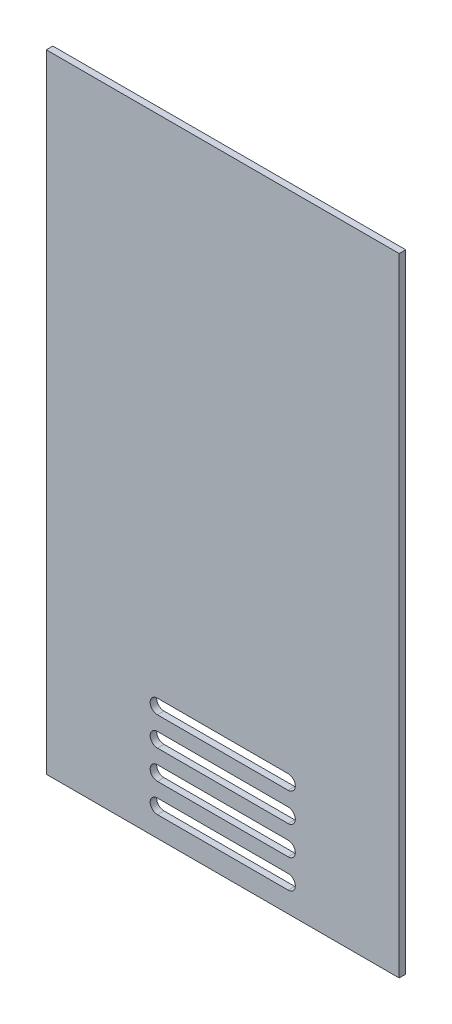
ISO-10303-21;
HEADER;
FILE_DESCRIPTION(('STEP AP214'),'2;1');
FILE_NAME('part.step','',(''),(''),'','','');
FILE_SCHEMA(('AUTOMOTIVE_DESIGN { 1 0 10303 214 1 1 1 1 }'));
ENDSEC;
DATA;
#1=APPLICATION_CONTEXT('core data for automotive mechanical design processes');
#2=APPLICATION_PROTOCOL_DEFINITION('international standard','automotive_design',2000,#1);
#3=PRODUCT_CONTEXT('',#1,'mechanical');
#4=PRODUCT('Part','Part','',(#3));
#5=PRODUCT_RELATED_PRODUCT_CATEGORY('part','',(#4));
#6=PRODUCT_DEFINITION_FORMATION('','',#4);
#7=PRODUCT_DEFINITION_CONTEXT('part definition',#1,'design');
#8=PRODUCT_DEFINITION('design','',#6,#7);
#9=PRODUCT_DEFINITION_SHAPE('','',#8);
#10=(LENGTH_UNIT() NAMED_UNIT(*) SI_UNIT(.MILLI.,.METRE.));
#11=(NAMED_UNIT(*) PLANE_ANGLE_UNIT() SI_UNIT($,.RADIAN.));
#12=(NAMED_UNIT(*) SI_UNIT($,.STERADIAN.) SOLID_ANGLE_UNIT());
#13=UNCERTAINTY_MEASURE_WITH_UNIT(LENGTH_MEASURE(1.E-05),#10,'distance_accuracy_value','');
#14=(GEOMETRIC_REPRESENTATION_CONTEXT(3) GLOBAL_UNCERTAINTY_ASSIGNED_CONTEXT((#13)) GLOBAL_UNIT_ASSIGNED_CONTEXT((#10,
#11,#12)) REPRESENTATION_CONTEXT('',''));
#15=CARTESIAN_POINT('',(0.,0.,0.));
#16=DIRECTION('',(0.,0.,1.));
#17=DIRECTION('',(1.,0.,0.));
#18=AXIS2_PLACEMENT_3D('',#15,#16,#17);
#19=CARTESIAN_POINT('',(-113.43670694864,87.7969033232628,3.175));
#20=DIRECTION('',(1.,0.,0.));
#21=DIRECTION('',(0.,1.,0.));
#22=AXIS2_PLACEMENT_3D('',#19,#20,#21);
#23=PLANE('',#22);
#24=DIRECTION('',(0.,-1.,0.));
#25=VECTOR('',#24,1.);
#26=CARTESIAN_POINT('',(-113.43670694864,87.7969033232628,0.));
#27=LINE('',#26,#25);
#28=CARTESIAN_POINT('',(-113.43670694864,87.7969033232628,0.));
#29=VERTEX_POINT('',#28);
#30=CARTESIAN_POINT('',(-113.43670694864,-217.003096676737,0.));
#31=VERTEX_POINT('',#30);
#32=EDGE_CURVE('E206',#29,#31,#27,.T.);
#33=ORIENTED_EDGE('',*,*,#32,.T.);
#34=DIRECTION('',(0.,0.,-1.));
#35=VECTOR('',#34,1.);
#36=CARTESIAN_POINT('',(-113.43670694864,-217.003096676737,3.175));
#37=LINE('',#36,#35);
#38=CARTESIAN_POINT('',(-113.43670694864,-217.003096676737,3.175));
#39=VERTEX_POINT('',#38);
#40=EDGE_CURVE('E11',#39,#31,#37,.T.);
#41=ORIENTED_EDGE('',*,*,#40,.F.);
#42=DIRECTION('',(0.,-1.,0.));
#43=VECTOR('',#42,1.);
#44=CARTESIAN_POINT('',(-113.43670694864,87.7969033232628,3.175));
#45=LINE('',#44,#43);
#46=CARTESIAN_POINT('',(-113.43670694864,87.7969033232628,3.175));
#47=VERTEX_POINT('',#46);
#48=EDGE_CURVE('E303',#47,#39,#45,.T.);
#49=ORIENTED_EDGE('',*,*,#48,.F.);
#50=DIRECTION('',(0.,0.,-1.));
#51=VECTOR('',#50,1.);
#52=CARTESIAN_POINT('',(-113.43670694864,87.7969033232628,3.175));
#53=LINE('',#52,#51);
#54=EDGE_CURVE('E313',#47,#29,#53,.T.);
#55=ORIENTED_EDGE('',*,*,#54,.T.);
#56=EDGE_LOOP('',(#33,#41,#49,#55));
#57=FACE_BOUND('',#56,.T.);
#58=ADVANCED_FACE('F33',(#57),#23,.F.);
#59=CARTESIAN_POINT('',(-113.43670694864,-217.003096676737,3.175));
#60=DIRECTION('',(0.,1.,0.));
#61=DIRECTION('',(0.,0.,1.));
#62=AXIS2_PLACEMENT_3D('',#59,#60,#61);
#63=PLANE('',#62);
#64=DIRECTION('',(1.,0.,0.));
#65=VECTOR('',#64,1.);
#66=CARTESIAN_POINT('',(-113.43670694864,-217.003096676737,0.));
#67=LINE('',#66,#65);
#68=CARTESIAN_POINT('',(58.0132930513596,-217.003096676737,0.));
#69=VERTEX_POINT('',#68);
#70=EDGE_CURVE('E316',#31,#69,#67,.T.);
#71=ORIENTED_EDGE('',*,*,#70,.T.);
#72=DIRECTION('',(0.,0.,-1.));
#73=VECTOR('',#72,1.);
#74=CARTESIAN_POINT('',(58.0132930513596,-217.003096676737,3.175));
#75=LINE('',#74,#73);
#76=CARTESIAN_POINT('',(58.0132930513596,-217.003096676737,3.175));
#77=VERTEX_POINT('',#76);
#78=EDGE_CURVE('E40',#77,#69,#75,.T.);
#79=ORIENTED_EDGE('',*,*,#78,.F.);
#80=DIRECTION('',(1.,0.,0.));
#81=VECTOR('',#80,1.);
#82=CARTESIAN_POINT('',(-113.43670694864,-217.003096676737,3.175));
#83=LINE('',#82,#81);
#84=EDGE_CURVE('E306',#39,#77,#83,.T.);
#85=ORIENTED_EDGE('',*,*,#84,.F.);
#86=ORIENTED_EDGE('',*,*,#40,.T.);
#87=EDGE_LOOP('',(#71,#79,#85,#86));
#88=FACE_BOUND('',#87,.T.);
#89=ADVANCED_FACE('F345',(#88),#63,.F.);
#90=CARTESIAN_POINT('',(58.0132930513595,87.7969033232628,3.175));
#91=DIRECTION('',(-1.,0.,0.));
#92=DIRECTION('',(0.,-1.,0.));
#93=AXIS2_PLACEMENT_3D('',#90,#91,#92);
#94=PLANE('',#93);
#95=DIRECTION('',(0.,1.,0.));
#96=VECTOR('',#95,1.);
#97=CARTESIAN_POINT('',(58.0132930513595,87.7969033232628,0.));
#98=LINE('',#97,#96);
#99=CARTESIAN_POINT('',(58.0132930513595,87.7969033232628,0.));
#100=VERTEX_POINT('',#99);
#101=EDGE_CURVE('E318',#69,#100,#98,.T.);
#102=ORIENTED_EDGE('',*,*,#101,.T.);
#103=DIRECTION('',(0.,0.,-1.));
#104=VECTOR('',#103,1.);
#105=CARTESIAN_POINT('',(58.0132930513595,87.7969033232628,3.175));
#106=LINE('',#105,#104);
#107=CARTESIAN_POINT('',(58.0132930513595,87.7969033232628,3.175));
#108=VERTEX_POINT('',#107);
#109=EDGE_CURVE('E323',#108,#100,#106,.T.);
#110=ORIENTED_EDGE('',*,*,#109,.F.);
#111=DIRECTION('',(0.,1.,0.));
#112=VECTOR('',#111,1.);
#113=CARTESIAN_POINT('',(58.0132930513595,87.7969033232628,3.175));
#114=LINE('',#113,#112);
#115=EDGE_CURVE('E309',#77,#108,#114,.T.);
#116=ORIENTED_EDGE('',*,*,#115,.F.);
#117=ORIENTED_EDGE('',*,*,#78,.T.);
#118=EDGE_LOOP('',(#102,#110,#116,#117));
#119=FACE_BOUND('',#118,.T.);
#120=ADVANCED_FACE('F330',(#119),#94,.F.);
#121=CARTESIAN_POINT('',(-113.43670694864,87.7969033232628,3.175));
#122=DIRECTION('',(0.,-1.,0.));
#123=DIRECTION('',(0.,0.,-1.));
#124=AXIS2_PLACEMENT_3D('',#121,#122,#123);
#125=PLANE('',#124);
#126=DIRECTION('',(-1.,0.,0.));
#127=VECTOR('',#126,1.);
#128=CARTESIAN_POINT('',(-113.43670694864,87.7969033232628,0.));
#129=LINE('',#128,#127);
#130=EDGE_CURVE('E307',#100,#29,#129,.T.);
#131=ORIENTED_EDGE('',*,*,#130,.T.);
#132=ORIENTED_EDGE('',*,*,#54,.F.);
#133=DIRECTION('',(-1.,0.,0.));
#134=VECTOR('',#133,1.);
#135=CARTESIAN_POINT('',(-113.43670694864,87.7969033232628,3.175));
#136=LINE('',#135,#134);
#137=EDGE_CURVE('E311',#108,#47,#136,.T.);
#138=ORIENTED_EDGE('',*,*,#137,.F.);
#139=ORIENTED_EDGE('',*,*,#109,.T.);
#140=EDGE_LOOP('',(#131,#132,#138,#139));
#141=FACE_BOUND('',#140,.T.);
#142=ADVANCED_FACE('F338',(#141),#125,.F.);
#143=CARTESIAN_POINT('',(0.,0.,3.175));
#144=DIRECTION('',(0.,0.,1.));
#145=DIRECTION('',(1.,0.,0.));
#146=AXIS2_PLACEMENT_3D('',#143,#144,#145);
#147=PLANE('',#146);
#148=CARTESIAN_POINT('',(-59.4617069486404,-203.503096676737,3.175));
#149=DIRECTION('',(0.,0.,1.));
#150=DIRECTION('',(1.,0.,0.));
#151=AXIS2_PLACEMENT_3D('',#148,#149,#150);
#152=CIRCLE('',#151,3.49999999999999);
#153=CARTESIAN_POINT('',(-59.4617069486404,-200.003096676737,3.175));
#154=VERTEX_POINT('',#153);
#155=CARTESIAN_POINT('',(-59.4617069486404,-207.003096676737,3.175));
#156=VERTEX_POINT('',#155);
#157=EDGE_CURVE('E47',#154,#156,#152,.T.);
#158=ORIENTED_EDGE('',*,*,#157,.F.);
#159=DIRECTION('',(-1.,0.,0.));
#160=VECTOR('',#159,1.);
#161=CARTESIAN_POINT('',(-59.4617069486404,-200.003096676737,3.175));
#162=LINE('',#161,#160);
#163=CARTESIAN_POINT('',(4.03829305135959,-200.003096676737,3.175));
#164=VERTEX_POINT('',#163);
#165=EDGE_CURVE('E190',#164,#154,#162,.T.);
#166=ORIENTED_EDGE('',*,*,#165,.F.);
#167=CARTESIAN_POINT('',(4.03829305135959,-203.503096676737,3.175));
#168=DIRECTION('',(0.,0.,1.));
#169=DIRECTION('',(-1.,0.,0.));
#170=AXIS2_PLACEMENT_3D('',#167,#168,#169);
#171=CIRCLE('',#170,3.49999999999999);
#172=CARTESIAN_POINT('',(4.03829305135959,-207.003096676737,3.175));
#173=VERTEX_POINT('',#172);
#174=EDGE_CURVE('E193',#173,#164,#171,.T.);
#175=ORIENTED_EDGE('',*,*,#174,.F.);
#176=DIRECTION('',(1.,0.,0.));
#177=VECTOR('',#176,1.);
#178=CARTESIAN_POINT('',(-59.4617069486404,-207.003096676737,3.175));
#179=LINE('',#178,#177);
#180=EDGE_CURVE('E199',#156,#173,#179,.T.);
#181=ORIENTED_EDGE('',*,*,#180,.F.);
#182=EDGE_LOOP('',(#158,#166,#175,#181));
#183=FACE_BOUND('',#182,.T.);
#184=CARTESIAN_POINT('',(-59.4617069486404,-189.503096676737,3.175));
#185=DIRECTION('',(0.,0.,1.));
#186=DIRECTION('',(1.,0.,0.));
#187=AXIS2_PLACEMENT_3D('',#184,#185,#186);
#188=CIRCLE('',#187,3.49999999999998);
#189=CARTESIAN_POINT('',(-59.4617069486404,-186.003096676737,3.175));
#190=VERTEX_POINT('',#189);
#191=CARTESIAN_POINT('',(-59.4617069486404,-193.003096676737,3.175));
#192=VERTEX_POINT('',#191);
#193=EDGE_CURVE('E55',#190,#192,#188,.T.);
#194=ORIENTED_EDGE('',*,*,#193,.F.);
#195=DIRECTION('',(-1.,0.,0.));
#196=VECTOR('',#195,1.);
#197=CARTESIAN_POINT('',(-59.4617069486404,-186.003096676737,3.175));
#198=LINE('',#197,#196);
#199=CARTESIAN_POINT('',(4.03829305135958,-186.003096676737,3.175));
#200=VERTEX_POINT('',#199);
#201=EDGE_CURVE('E214',#200,#190,#198,.T.);
#202=ORIENTED_EDGE('',*,*,#201,.F.);
#203=CARTESIAN_POINT('',(4.03829305135958,-189.503096676737,3.175));
#204=DIRECTION('',(0.,0.,1.));
#205=DIRECTION('',(-1.,0.,0.));
#206=AXIS2_PLACEMENT_3D('',#203,#204,#205);
#207=CIRCLE('',#206,3.49999999999998);
#208=CARTESIAN_POINT('',(4.03829305135958,-193.003096676737,3.175));
#209=VERTEX_POINT('',#208);
#210=EDGE_CURVE('E229',#209,#200,#207,.T.);
#211=ORIENTED_EDGE('',*,*,#210,.F.);
#212=DIRECTION('',(1.,0.,0.));
#213=VECTOR('',#212,1.);
#214=CARTESIAN_POINT('',(-59.4617069486404,-193.003096676737,3.175));
#215=LINE('',#214,#213);
#216=EDGE_CURVE('E225',#192,#209,#215,.T.);
#217=ORIENTED_EDGE('',*,*,#216,.F.);
#218=EDGE_LOOP('',(#194,#202,#211,#217));
#219=FACE_BOUND('',#218,.T.);
#220=CARTESIAN_POINT('',(-59.4617069486404,-175.503096676737,3.175));
#221=DIRECTION('',(0.,0.,1.));
#222=DIRECTION('',(1.,0.,0.));
#223=AXIS2_PLACEMENT_3D('',#220,#221,#222);
#224=CIRCLE('',#223,3.49999999999998);
#225=CARTESIAN_POINT('',(-59.4617069486404,-172.003096676737,3.175));
#226=VERTEX_POINT('',#225);
#227=CARTESIAN_POINT('',(-59.4617069486404,-179.003096676737,3.175));
#228=VERTEX_POINT('',#227);
#229=EDGE_CURVE('E254',#226,#228,#224,.T.);
#230=ORIENTED_EDGE('',*,*,#229,.F.);
#231=DIRECTION('',(-1.,0.,0.));
#232=VECTOR('',#231,1.);
#233=CARTESIAN_POINT('',(-59.4617069486404,-172.003096676737,3.175));
#234=LINE('',#233,#232);
#235=CARTESIAN_POINT('',(4.03829305135959,-172.003096676737,3.175));
#236=VERTEX_POINT('',#235);
#237=EDGE_CURVE('E244',#236,#226,#234,.T.);
#238=ORIENTED_EDGE('',*,*,#237,.F.);
#239=CARTESIAN_POINT('',(4.03829305135959,-175.503096676737,3.175));
#240=DIRECTION('',(0.,0.,1.));
#241=DIRECTION('',(-1.,0.,0.));
#242=AXIS2_PLACEMENT_3D('',#239,#240,#241);
#243=CIRCLE('',#242,3.49999999999998);
#244=CARTESIAN_POINT('',(4.03829305135959,-179.003096676737,3.175));
#245=VERTEX_POINT('',#244);
#246=EDGE_CURVE('E260',#245,#236,#243,.T.);
#247=ORIENTED_EDGE('',*,*,#246,.F.);
#248=DIRECTION('',(1.,0.,0.));
#249=VECTOR('',#248,1.);
#250=CARTESIAN_POINT('',(-59.4617069486404,-179.003096676737,3.175));
#251=LINE('',#250,#249);
#252=EDGE_CURVE('E256',#228,#245,#251,.T.);
#253=ORIENTED_EDGE('',*,*,#252,.F.);
#254=EDGE_LOOP('',(#230,#238,#247,#253));
#255=FACE_BOUND('',#254,.T.);
#256=CARTESIAN_POINT('',(-59.4617069486404,-161.503096676737,3.175));
#257=DIRECTION('',(0.,0.,1.));
#258=DIRECTION('',(1.,0.,0.));
#259=AXIS2_PLACEMENT_3D('',#256,#257,#258);
#260=CIRCLE('',#259,3.49999999999998);
#261=CARTESIAN_POINT('',(-59.4617069486404,-158.003096676737,3.175));
#262=VERTEX_POINT('',#261);
#263=CARTESIAN_POINT('',(-59.4617069486404,-165.003096676737,3.175));
#264=VERTEX_POINT('',#263);
#265=EDGE_CURVE('E286',#262,#264,#260,.T.);
#266=ORIENTED_EDGE('',*,*,#265,.F.);
#267=DIRECTION('',(-1.,0.,0.));
#268=VECTOR('',#267,1.);
#269=CARTESIAN_POINT('',(-59.4617069486404,-158.003096676737,3.175));
#270=LINE('',#269,#268);
#271=CARTESIAN_POINT('',(4.03829305135958,-158.003096676737,3.175));
#272=VERTEX_POINT('',#271);
#273=EDGE_CURVE('E276',#272,#262,#270,.T.);
#274=ORIENTED_EDGE('',*,*,#273,.F.);
#275=CARTESIAN_POINT('',(4.03829305135958,-161.503096676737,3.175));
#276=DIRECTION('',(0.,0.,1.));
#277=DIRECTION('',(-1.,0.,0.));
#278=AXIS2_PLACEMENT_3D('',#275,#276,#277);
#279=CIRCLE('',#278,3.49999999999998);
#280=CARTESIAN_POINT('',(4.03829305135958,-165.003096676737,3.175));
#281=VERTEX_POINT('',#280);
#282=EDGE_CURVE('E291',#281,#272,#279,.T.);
#283=ORIENTED_EDGE('',*,*,#282,.F.);
#284=DIRECTION('',(1.,0.,0.));
#285=VECTOR('',#284,1.);
#286=CARTESIAN_POINT('',(-59.4617069486404,-165.003096676737,3.175));
#287=LINE('',#286,#285);
#288=EDGE_CURVE('E288',#264,#281,#287,.T.);
#289=ORIENTED_EDGE('',*,*,#288,.F.);
#290=EDGE_LOOP('',(#266,#274,#283,#289));
#291=FACE_BOUND('',#290,.T.);
#292=ORIENTED_EDGE('',*,*,#48,.T.);
#293=ORIENTED_EDGE('',*,*,#84,.T.);
#294=ORIENTED_EDGE('',*,*,#115,.T.);
#295=ORIENTED_EDGE('',*,*,#137,.T.);
#296=EDGE_LOOP('',(#292,#293,#294,#295));
#297=FACE_BOUND('',#296,.T.);
#298=ADVANCED_FACE('F344',(#183,#219,#255,#291,#297),#147,.T.);
#299=CARTESIAN_POINT('',(0.,0.,0.));
#300=DIRECTION('',(0.,0.,1.));
#301=DIRECTION('',(1.,0.,0.));
#302=AXIS2_PLACEMENT_3D('',#299,#300,#301);
#303=PLANE('',#302);
#304=DIRECTION('',(-1.,0.,0.));
#305=VECTOR('',#304,1.);
#306=CARTESIAN_POINT('',(-59.4617069486404,-200.003096676737,0.));
#307=LINE('',#306,#305);
#308=CARTESIAN_POINT('',(4.03829305135959,-200.003096676737,0.));
#309=VERTEX_POINT('',#308);
#310=CARTESIAN_POINT('',(-59.4617069486404,-200.003096676737,0.));
#311=VERTEX_POINT('',#310);
#312=EDGE_CURVE('E177',#309,#311,#307,.T.);
#313=ORIENTED_EDGE('',*,*,#312,.T.);
#314=CARTESIAN_POINT('',(-59.4617069486404,-203.503096676737,0.));
#315=DIRECTION('',(0.,0.,1.));
#316=DIRECTION('',(1.,0.,0.));
#317=AXIS2_PLACEMENT_3D('',#314,#315,#316);
#318=CIRCLE('',#317,3.49999999999999);
#319=CARTESIAN_POINT('',(-59.4617069486404,-207.003096676737,0.));
#320=VERTEX_POINT('',#319);
#321=EDGE_CURVE('E171',#311,#320,#318,.T.);
#322=ORIENTED_EDGE('',*,*,#321,.T.);
#323=DIRECTION('',(1.,0.,0.));
#324=VECTOR('',#323,1.);
#325=CARTESIAN_POINT('',(-59.4617069486404,-207.003096676737,0.));
#326=LINE('',#325,#324);
#327=CARTESIAN_POINT('',(4.03829305135959,-207.003096676737,0.));
#328=VERTEX_POINT('',#327);
#329=EDGE_CURVE('E181',#320,#328,#326,.T.);
#330=ORIENTED_EDGE('',*,*,#329,.T.);
#331=CARTESIAN_POINT('',(4.03829305135959,-203.503096676737,0.));
#332=DIRECTION('',(0.,0.,1.));
#333=DIRECTION('',(-1.,0.,0.));
#334=AXIS2_PLACEMENT_3D('',#331,#332,#333);
#335=CIRCLE('',#334,3.49999999999999);
#336=EDGE_CURVE('E185',#328,#309,#335,.T.);
#337=ORIENTED_EDGE('',*,*,#336,.T.);
#338=EDGE_LOOP('',(#313,#322,#330,#337));
#339=FACE_BOUND('',#338,.T.);
#340=DIRECTION('',(-1.,0.,0.));
#341=VECTOR('',#340,1.);
#342=CARTESIAN_POINT('',(-59.4617069486404,-186.003096676737,0.));
#343=LINE('',#342,#341);
#344=CARTESIAN_POINT('',(4.03829305135958,-186.003096676737,0.));
#345=VERTEX_POINT('',#344);
#346=CARTESIAN_POINT('',(-59.4617069486404,-186.003096676737,0.));
#347=VERTEX_POINT('',#346);
#348=EDGE_CURVE('E220',#345,#347,#343,.T.);
#349=ORIENTED_EDGE('',*,*,#348,.T.);
#350=CARTESIAN_POINT('',(-59.4617069486404,-189.503096676737,0.));
#351=DIRECTION('',(0.,0.,1.));
#352=DIRECTION('',(1.,0.,0.));
#353=AXIS2_PLACEMENT_3D('',#350,#351,#352);
#354=CIRCLE('',#353,3.49999999999998);
#355=CARTESIAN_POINT('',(-59.4617069486404,-193.003096676737,0.));
#356=VERTEX_POINT('',#355);
#357=EDGE_CURVE('E210',#347,#356,#354,.T.);
#358=ORIENTED_EDGE('',*,*,#357,.T.);
#359=DIRECTION('',(1.,0.,0.));
#360=VECTOR('',#359,1.);
#361=CARTESIAN_POINT('',(-59.4617069486404,-193.003096676737,0.));
#362=LINE('',#361,#360);
#363=CARTESIAN_POINT('',(4.03829305135958,-193.003096676737,0.));
#364=VERTEX_POINT('',#363);
#365=EDGE_CURVE('E213',#356,#364,#362,.T.);
#366=ORIENTED_EDGE('',*,*,#365,.T.);
#367=CARTESIAN_POINT('',(4.03829305135958,-189.503096676737,0.));
#368=DIRECTION('',(0.,0.,1.));
#369=DIRECTION('',(-1.,0.,0.));
#370=AXIS2_PLACEMENT_3D('',#367,#368,#369);
#371=CIRCLE('',#370,3.49999999999998);
#372=EDGE_CURVE('E217',#364,#345,#371,.T.);
#373=ORIENTED_EDGE('',*,*,#372,.T.);
#374=EDGE_LOOP('',(#349,#358,#366,#373));
#375=FACE_BOUND('',#374,.T.);
#376=DIRECTION('',(-1.,0.,0.));
#377=VECTOR('',#376,1.);
#378=CARTESIAN_POINT('',(-59.4617069486404,-172.003096676737,0.));
#379=LINE('',#378,#377);
#380=CARTESIAN_POINT('',(4.03829305135959,-172.003096676737,0.));
#381=VERTEX_POINT('',#380);
#382=CARTESIAN_POINT('',(-59.4617069486404,-172.003096676737,0.));
#383=VERTEX_POINT('',#382);
#384=EDGE_CURVE('E250',#381,#383,#379,.T.);
#385=ORIENTED_EDGE('',*,*,#384,.T.);
#386=CARTESIAN_POINT('',(-59.4617069486404,-175.503096676737,0.));
#387=DIRECTION('',(0.,0.,1.));
#388=DIRECTION('',(1.,0.,0.));
#389=AXIS2_PLACEMENT_3D('',#386,#387,#388);
#390=CIRCLE('',#389,3.49999999999998);
#391=CARTESIAN_POINT('',(-59.4617069486404,-179.003096676737,0.));
#392=VERTEX_POINT('',#391);
#393=EDGE_CURVE('E240',#383,#392,#390,.T.);
#394=ORIENTED_EDGE('',*,*,#393,.T.);
#395=DIRECTION('',(1.,0.,0.));
#396=VECTOR('',#395,1.);
#397=CARTESIAN_POINT('',(-59.4617069486404,-179.003096676737,0.));
#398=LINE('',#397,#396);
#399=CARTESIAN_POINT('',(4.03829305135959,-179.003096676737,0.));
#400=VERTEX_POINT('',#399);
#401=EDGE_CURVE('E243',#392,#400,#398,.T.);
#402=ORIENTED_EDGE('',*,*,#401,.T.);
#403=CARTESIAN_POINT('',(4.03829305135959,-175.503096676737,0.));
#404=DIRECTION('',(0.,0.,1.));
#405=DIRECTION('',(-1.,0.,0.));
#406=AXIS2_PLACEMENT_3D('',#403,#404,#405);
#407=CIRCLE('',#406,3.49999999999998);
#408=EDGE_CURVE('E247',#400,#381,#407,.T.);
#409=ORIENTED_EDGE('',*,*,#408,.T.);
#410=EDGE_LOOP('',(#385,#394,#402,#409));
#411=FACE_BOUND('',#410,.T.);
#412=DIRECTION('',(-1.,0.,0.));
#413=VECTOR('',#412,1.);
#414=CARTESIAN_POINT('',(-59.4617069486404,-158.003096676737,0.));
#415=LINE('',#414,#413);
#416=CARTESIAN_POINT('',(4.03829305135958,-158.003096676737,0.));
#417=VERTEX_POINT('',#416);
#418=CARTESIAN_POINT('',(-59.4617069486404,-158.003096676737,0.));
#419=VERTEX_POINT('',#418);
#420=EDGE_CURVE('E282',#417,#419,#415,.T.);
#421=ORIENTED_EDGE('',*,*,#420,.T.);
#422=CARTESIAN_POINT('',(-59.4617069486404,-161.503096676737,0.));
#423=DIRECTION('',(0.,0.,1.));
#424=DIRECTION('',(1.,0.,0.));
#425=AXIS2_PLACEMENT_3D('',#422,#423,#424);
#426=CIRCLE('',#425,3.49999999999998);
#427=CARTESIAN_POINT('',(-59.4617069486404,-165.003096676737,0.));
#428=VERTEX_POINT('',#427);
#429=EDGE_CURVE('E272',#419,#428,#426,.T.);
#430=ORIENTED_EDGE('',*,*,#429,.T.);
#431=DIRECTION('',(1.,0.,0.));
#432=VECTOR('',#431,1.);
#433=CARTESIAN_POINT('',(-59.4617069486404,-165.003096676737,0.));
#434=LINE('',#433,#432);
#435=CARTESIAN_POINT('',(4.03829305135958,-165.003096676737,0.));
#436=VERTEX_POINT('',#435);
#437=EDGE_CURVE('E275',#428,#436,#434,.T.);
#438=ORIENTED_EDGE('',*,*,#437,.T.);
#439=CARTESIAN_POINT('',(4.03829305135958,-161.503096676737,0.));
#440=DIRECTION('',(0.,0.,1.));
#441=DIRECTION('',(-1.,0.,0.));
#442=AXIS2_PLACEMENT_3D('',#439,#440,#441);
#443=CIRCLE('',#442,3.49999999999998);
#444=EDGE_CURVE('E279',#436,#417,#443,.T.);
#445=ORIENTED_EDGE('',*,*,#444,.T.);
#446=EDGE_LOOP('',(#421,#430,#438,#445));
#447=FACE_BOUND('',#446,.T.);
#448=ORIENTED_EDGE('',*,*,#32,.F.);
#449=ORIENTED_EDGE('',*,*,#130,.F.);
#450=ORIENTED_EDGE('',*,*,#101,.F.);
#451=ORIENTED_EDGE('',*,*,#70,.F.);
#452=EDGE_LOOP('',(#448,#449,#450,#451));
#453=FACE_BOUND('',#452,.T.);
#454=ADVANCED_FACE('F187',(#339,#375,#411,#447,#453),#303,.F.);
#455=CARTESIAN_POINT('',(-59.4617069486404,-161.503096676737,0.));
#456=DIRECTION('',(0.,0.,1.));
#457=DIRECTION('',(1.,0.,0.));
#458=AXIS2_PLACEMENT_3D('',#455,#456,#457);
#459=CYLINDRICAL_SURFACE('',#458,3.49999999999998);
#460=ORIENTED_EDGE('',*,*,#265,.T.);
#461=DIRECTION('',(0.,0.,1.));
#462=VECTOR('',#461,1.);
#463=CARTESIAN_POINT('',(-59.4617069486404,-165.003096676737,0.));
#464=LINE('',#463,#462);
#465=EDGE_CURVE('E285',#428,#264,#464,.T.);
#466=ORIENTED_EDGE('',*,*,#465,.F.);
#467=ORIENTED_EDGE('',*,*,#429,.F.);
#468=DIRECTION('',(0.,0.,1.));
#469=VECTOR('',#468,1.);
#470=CARTESIAN_POINT('',(-59.4617069486404,-158.003096676737,0.));
#471=LINE('',#470,#469);
#472=EDGE_CURVE('E257',#419,#262,#471,.T.);
#473=ORIENTED_EDGE('',*,*,#472,.T.);
#474=EDGE_LOOP('',(#460,#466,#467,#473));
#475=FACE_BOUND('',#474,.T.);
#476=ADVANCED_FACE('F357',(#475),#459,.F.);
#477=CARTESIAN_POINT('',(-59.4617069486404,-158.003096676737,0.));
#478=DIRECTION('',(0.,1.,0.));
#479=DIRECTION('',(0.,0.,1.));
#480=AXIS2_PLACEMENT_3D('',#477,#478,#479);
#481=PLANE('',#480);
#482=ORIENTED_EDGE('',*,*,#273,.T.);
#483=ORIENTED_EDGE('',*,*,#472,.F.);
#484=ORIENTED_EDGE('',*,*,#420,.F.);
#485=DIRECTION('',(0.,0.,1.));
#486=VECTOR('',#485,1.);
#487=CARTESIAN_POINT('',(4.03829305135958,-158.003096676737,0.));
#488=LINE('',#487,#486);
#489=EDGE_CURVE('E297',#417,#272,#488,.T.);
#490=ORIENTED_EDGE('',*,*,#489,.T.);
#491=EDGE_LOOP('',(#482,#483,#484,#490));
#492=FACE_BOUND('',#491,.T.);
#493=ADVANCED_FACE('F363',(#492),#481,.F.);
#494=CARTESIAN_POINT('',(4.03829305135958,-161.503096676737,0.));
#495=DIRECTION('',(0.,0.,1.));
#496=DIRECTION('',(1.,0.,0.));
#497=AXIS2_PLACEMENT_3D('',#494,#495,#496);
#498=CYLINDRICAL_SURFACE('',#497,3.49999999999998);
#499=ORIENTED_EDGE('',*,*,#282,.T.);
#500=ORIENTED_EDGE('',*,*,#489,.F.);
#501=ORIENTED_EDGE('',*,*,#444,.F.);
#502=DIRECTION('',(0.,0.,1.));
#503=VECTOR('',#502,1.);
#504=CARTESIAN_POINT('',(4.03829305135958,-165.003096676737,0.));
#505=LINE('',#504,#503);
#506=EDGE_CURVE('E299',#436,#281,#505,.T.);
#507=ORIENTED_EDGE('',*,*,#506,.T.);
#508=EDGE_LOOP('',(#499,#500,#501,#507));
#509=FACE_BOUND('',#508,.T.);
#510=ADVANCED_FACE('F369',(#509),#498,.F.);
#511=CARTESIAN_POINT('',(-59.4617069486404,-165.003096676737,0.));
#512=DIRECTION('',(0.,-1.,0.));
#513=DIRECTION('',(0.,0.,-1.));
#514=AXIS2_PLACEMENT_3D('',#511,#512,#513);
#515=PLANE('',#514);
#516=ORIENTED_EDGE('',*,*,#288,.T.);
#517=ORIENTED_EDGE('',*,*,#506,.F.);
#518=ORIENTED_EDGE('',*,*,#437,.F.);
#519=ORIENTED_EDGE('',*,*,#465,.T.);
#520=EDGE_LOOP('',(#516,#517,#518,#519));
#521=FACE_BOUND('',#520,.T.);
#522=ADVANCED_FACE('F365',(#521),#515,.F.);
#523=CARTESIAN_POINT('',(-59.4617069486404,-175.503096676737,0.));
#524=DIRECTION('',(0.,0.,1.));
#525=DIRECTION('',(1.,0.,0.));
#526=AXIS2_PLACEMENT_3D('',#523,#524,#525);
#527=CYLINDRICAL_SURFACE('',#526,3.49999999999998);
#528=ORIENTED_EDGE('',*,*,#229,.T.);
#529=DIRECTION('',(0.,0.,1.));
#530=VECTOR('',#529,1.);
#531=CARTESIAN_POINT('',(-59.4617069486404,-179.003096676737,0.));
#532=LINE('',#531,#530);
#533=EDGE_CURVE('E253',#392,#228,#532,.T.);
#534=ORIENTED_EDGE('',*,*,#533,.F.);
#535=ORIENTED_EDGE('',*,*,#393,.F.);
#536=DIRECTION('',(0.,0.,1.));
#537=VECTOR('',#536,1.);
#538=CARTESIAN_POINT('',(-59.4617069486404,-172.003096676737,0.));
#539=LINE('',#538,#537);
#540=EDGE_CURVE('E226',#383,#226,#539,.T.);
#541=ORIENTED_EDGE('',*,*,#540,.T.);
#542=EDGE_LOOP('',(#528,#534,#535,#541));
#543=FACE_BOUND('',#542,.T.);
#544=ADVANCED_FACE('F368',(#543),#527,.F.);
#545=CARTESIAN_POINT('',(-59.4617069486404,-172.003096676737,0.));
#546=DIRECTION('',(0.,1.,0.));
#547=DIRECTION('',(0.,0.,1.));
#548=AXIS2_PLACEMENT_3D('',#545,#546,#547);
#549=PLANE('',#548);
#550=ORIENTED_EDGE('',*,*,#237,.T.);
#551=ORIENTED_EDGE('',*,*,#540,.F.);
#552=ORIENTED_EDGE('',*,*,#384,.F.);
#553=DIRECTION('',(0.,0.,1.));
#554=VECTOR('',#553,1.);
#555=CARTESIAN_POINT('',(4.03829305135959,-172.003096676737,0.));
#556=LINE('',#555,#554);
#557=EDGE_CURVE('E266',#381,#236,#556,.T.);
#558=ORIENTED_EDGE('',*,*,#557,.T.);
#559=EDGE_LOOP('',(#550,#551,#552,#558));
#560=FACE_BOUND('',#559,.T.);
#561=ADVANCED_FACE('F379',(#560),#549,.F.);
#562=CARTESIAN_POINT('',(4.03829305135959,-175.503096676737,0.));
#563=DIRECTION('',(0.,0.,1.));
#564=DIRECTION('',(1.,0.,0.));
#565=AXIS2_PLACEMENT_3D('',#562,#563,#564);
#566=CYLINDRICAL_SURFACE('',#565,3.49999999999998);
#567=ORIENTED_EDGE('',*,*,#246,.T.);
#568=ORIENTED_EDGE('',*,*,#557,.F.);
#569=ORIENTED_EDGE('',*,*,#408,.F.);
#570=DIRECTION('',(0.,0.,1.));
#571=VECTOR('',#570,1.);
#572=CARTESIAN_POINT('',(4.03829305135959,-179.003096676737,0.));
#573=LINE('',#572,#571);
#574=EDGE_CURVE('E268',#400,#245,#573,.T.);
#575=ORIENTED_EDGE('',*,*,#574,.T.);
#576=EDGE_LOOP('',(#567,#568,#569,#575));
#577=FACE_BOUND('',#576,.T.);
#578=ADVANCED_FACE('F385',(#577),#566,.F.);
#579=CARTESIAN_POINT('',(-59.4617069486404,-179.003096676737,0.));
#580=DIRECTION('',(0.,-1.,0.));
#581=DIRECTION('',(0.,0.,-1.));
#582=AXIS2_PLACEMENT_3D('',#579,#580,#581);
#583=PLANE('',#582);
#584=ORIENTED_EDGE('',*,*,#252,.T.);
#585=ORIENTED_EDGE('',*,*,#574,.F.);
#586=ORIENTED_EDGE('',*,*,#401,.F.);
#587=ORIENTED_EDGE('',*,*,#533,.T.);
#588=EDGE_LOOP('',(#584,#585,#586,#587));
#589=FACE_BOUND('',#588,.T.);
#590=ADVANCED_FACE('F381',(#589),#583,.F.);
#591=CARTESIAN_POINT('',(-59.4617069486404,-189.503096676737,0.));
#592=DIRECTION('',(0.,0.,1.));
#593=DIRECTION('',(1.,0.,0.));
#594=AXIS2_PLACEMENT_3D('',#591,#592,#593);
#595=CYLINDRICAL_SURFACE('',#594,3.49999999999998);
#596=ORIENTED_EDGE('',*,*,#193,.T.);
#597=DIRECTION('',(0.,0.,1.));
#598=VECTOR('',#597,1.);
#599=CARTESIAN_POINT('',(-59.4617069486404,-193.003096676737,0.));
#600=LINE('',#599,#598);
#601=EDGE_CURVE('E223',#356,#192,#600,.T.);
#602=ORIENTED_EDGE('',*,*,#601,.F.);
#603=ORIENTED_EDGE('',*,*,#357,.F.);
#604=DIRECTION('',(0.,0.,1.));
#605=VECTOR('',#604,1.);
#606=CARTESIAN_POINT('',(-59.4617069486404,-186.003096676737,0.));
#607=LINE('',#606,#605);
#608=EDGE_CURVE('E200',#347,#190,#607,.T.);
#609=ORIENTED_EDGE('',*,*,#608,.T.);
#610=EDGE_LOOP('',(#596,#602,#603,#609));
#611=FACE_BOUND('',#610,.T.);
#612=ADVANCED_FACE('F384',(#611),#595,.F.);
#613=CARTESIAN_POINT('',(-59.4617069486404,-186.003096676737,0.));
#614=DIRECTION('',(0.,1.,0.));
#615=DIRECTION('',(0.,0.,1.));
#616=AXIS2_PLACEMENT_3D('',#613,#614,#615);
#617=PLANE('',#616);
#618=ORIENTED_EDGE('',*,*,#201,.T.);
#619=ORIENTED_EDGE('',*,*,#608,.F.);
#620=ORIENTED_EDGE('',*,*,#348,.F.);
#621=DIRECTION('',(0.,0.,1.));
#622=VECTOR('',#621,1.);
#623=CARTESIAN_POINT('',(4.03829305135958,-186.003096676737,0.));
#624=LINE('',#623,#622);
#625=EDGE_CURVE('E235',#345,#200,#624,.T.);
#626=ORIENTED_EDGE('',*,*,#625,.T.);
#627=EDGE_LOOP('',(#618,#619,#620,#626));
#628=FACE_BOUND('',#627,.T.);
#629=ADVANCED_FACE('F395',(#628),#617,.F.);
#630=CARTESIAN_POINT('',(4.03829305135958,-189.503096676737,0.));
#631=DIRECTION('',(0.,0.,1.));
#632=DIRECTION('',(1.,0.,0.));
#633=AXIS2_PLACEMENT_3D('',#630,#631,#632);
#634=CYLINDRICAL_SURFACE('',#633,3.49999999999998);
#635=ORIENTED_EDGE('',*,*,#210,.T.);
#636=ORIENTED_EDGE('',*,*,#625,.F.);
#637=ORIENTED_EDGE('',*,*,#372,.F.);
#638=DIRECTION('',(0.,0.,1.));
#639=VECTOR('',#638,1.);
#640=CARTESIAN_POINT('',(4.03829305135958,-193.003096676737,0.));
#641=LINE('',#640,#639);
#642=EDGE_CURVE('E237',#364,#209,#641,.T.);
#643=ORIENTED_EDGE('',*,*,#642,.T.);
#644=EDGE_LOOP('',(#635,#636,#637,#643));
#645=FACE_BOUND('',#644,.T.);
#646=ADVANCED_FACE('F399',(#645),#634,.F.);
#647=CARTESIAN_POINT('',(-59.4617069486404,-193.003096676737,0.));
#648=DIRECTION('',(0.,-1.,0.));
#649=DIRECTION('',(0.,0.,-1.));
#650=AXIS2_PLACEMENT_3D('',#647,#648,#649);
#651=PLANE('',#650);
#652=ORIENTED_EDGE('',*,*,#216,.T.);
#653=ORIENTED_EDGE('',*,*,#642,.F.);
#654=ORIENTED_EDGE('',*,*,#365,.F.);
#655=ORIENTED_EDGE('',*,*,#601,.T.);
#656=EDGE_LOOP('',(#652,#653,#654,#655));
#657=FACE_BOUND('',#656,.T.);
#658=ADVANCED_FACE('F396',(#657),#651,.F.);
#659=CARTESIAN_POINT('',(-59.4617069486404,-203.503096676737,0.));
#660=DIRECTION('',(0.,0.,1.));
#661=DIRECTION('',(1.,0.,0.));
#662=AXIS2_PLACEMENT_3D('',#659,#660,#661);
#663=CYLINDRICAL_SURFACE('',#662,3.49999999999999);
#664=ORIENTED_EDGE('',*,*,#157,.T.);
#665=DIRECTION('',(0.,0.,1.));
#666=VECTOR('',#665,1.);
#667=CARTESIAN_POINT('',(-59.4617069486404,-207.003096676737,0.));
#668=LINE('',#667,#666);
#669=EDGE_CURVE('E167',#320,#156,#668,.T.);
#670=ORIENTED_EDGE('',*,*,#669,.F.);
#671=ORIENTED_EDGE('',*,*,#321,.F.);
#672=DIRECTION('',(0.,0.,1.));
#673=VECTOR('',#672,1.);
#674=CARTESIAN_POINT('',(-59.4617069486404,-200.003096676737,0.));
#675=LINE('',#674,#673);
#676=EDGE_CURVE('E204',#311,#154,#675,.T.);
#677=ORIENTED_EDGE('',*,*,#676,.T.);
#678=EDGE_LOOP('',(#664,#670,#671,#677));
#679=FACE_BOUND('',#678,.T.);
#680=ADVANCED_FACE('F169',(#679),#663,.F.);
#681=CARTESIAN_POINT('',(-59.4617069486404,-200.003096676737,0.));
#682=DIRECTION('',(0.,1.,0.));
#683=DIRECTION('',(0.,0.,1.));
#684=AXIS2_PLACEMENT_3D('',#681,#682,#683);
#685=PLANE('',#684);
#686=ORIENTED_EDGE('',*,*,#165,.T.);
#687=ORIENTED_EDGE('',*,*,#676,.F.);
#688=ORIENTED_EDGE('',*,*,#312,.F.);
#689=DIRECTION('',(0.,0.,1.));
#690=VECTOR('',#689,1.);
#691=CARTESIAN_POINT('',(4.03829305135959,-200.003096676737,0.));
#692=LINE('',#691,#690);
#693=EDGE_CURVE('E207',#309,#164,#692,.T.);
#694=ORIENTED_EDGE('',*,*,#693,.T.);
#695=EDGE_LOOP('',(#686,#687,#688,#694));
#696=FACE_BOUND('',#695,.T.);
#697=ADVANCED_FACE('F409',(#696),#685,.F.);
#698=CARTESIAN_POINT('',(4.03829305135959,-203.503096676737,0.));
#699=DIRECTION('',(0.,0.,1.));
#700=DIRECTION('',(1.,0.,0.));
#701=AXIS2_PLACEMENT_3D('',#698,#699,#700);
#702=CYLINDRICAL_SURFACE('',#701,3.49999999999999);
#703=ORIENTED_EDGE('',*,*,#174,.T.);
#704=ORIENTED_EDGE('',*,*,#693,.F.);
#705=ORIENTED_EDGE('',*,*,#336,.F.);
#706=DIRECTION('',(0.,0.,1.));
#707=VECTOR('',#706,1.);
#708=CARTESIAN_POINT('',(4.03829305135959,-207.003096676737,0.));
#709=LINE('',#708,#707);
#710=EDGE_CURVE('E176',#328,#173,#709,.T.);
#711=ORIENTED_EDGE('',*,*,#710,.T.);
#712=EDGE_LOOP('',(#703,#704,#705,#711));
#713=FACE_BOUND('',#712,.T.);
#714=ADVANCED_FACE('F412',(#713),#702,.F.);
#715=CARTESIAN_POINT('',(-59.4617069486404,-207.003096676737,0.));
#716=DIRECTION('',(0.,-1.,0.));
#717=DIRECTION('',(0.,0.,-1.));
#718=AXIS2_PLACEMENT_3D('',#715,#716,#717);
#719=PLANE('',#718);
#720=ORIENTED_EDGE('',*,*,#180,.T.);
#721=ORIENTED_EDGE('',*,*,#710,.F.);
#722=ORIENTED_EDGE('',*,*,#329,.F.);
#723=ORIENTED_EDGE('',*,*,#669,.T.);
#724=EDGE_LOOP('',(#720,#721,#722,#723));
#725=FACE_BOUND('',#724,.T.);
#726=ADVANCED_FACE('F182',(#725),#719,.F.);
#727=CLOSED_SHELL('',(#58,#89,#120,#142,#298,#454,#476,#493,#510,#522,#544,#561,#578,#590,#612,
#629,#646,#658,#680,#697,#714,#726));
#728=MANIFOLD_SOLID_BREP('B2',#727);
#729=ADVANCED_BREP_SHAPE_REPRESENTATION('',(#18,#728),#14);
#730=SHAPE_DEFINITION_REPRESENTATION(#9,#729);
ENDSEC;
END-ISO-10303-21;
